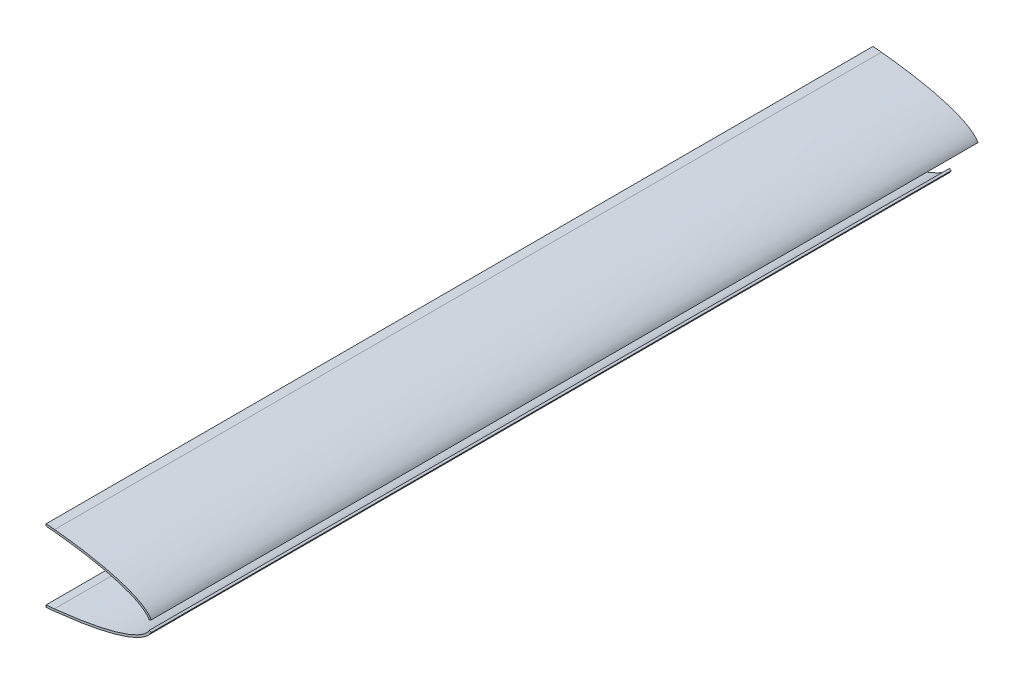
ISO-10303-21;
HEADER;
FILE_DESCRIPTION(('STEP AP214'),'2;1');
FILE_NAME('part.step','',(''),(''),'','','');
FILE_SCHEMA(('AUTOMOTIVE_DESIGN { 1 0 10303 214 1 1 1 1 }'));
ENDSEC;
DATA;
#1=APPLICATION_CONTEXT('core data for automotive mechanical design processes');
#2=APPLICATION_PROTOCOL_DEFINITION('international standard','automotive_design',2000,#1);
#3=PRODUCT_CONTEXT('',#1,'mechanical');
#4=PRODUCT('Part','Part','',(#3));
#5=PRODUCT_RELATED_PRODUCT_CATEGORY('part','',(#4));
#6=PRODUCT_DEFINITION_FORMATION('','',#4);
#7=PRODUCT_DEFINITION_CONTEXT('part definition',#1,'design');
#8=PRODUCT_DEFINITION('design','',#6,#7);
#9=PRODUCT_DEFINITION_SHAPE('','',#8);
#10=(LENGTH_UNIT() NAMED_UNIT(*) SI_UNIT(.MILLI.,.METRE.));
#11=(NAMED_UNIT(*) PLANE_ANGLE_UNIT() SI_UNIT($,.RADIAN.));
#12=(NAMED_UNIT(*) SI_UNIT($,.STERADIAN.) SOLID_ANGLE_UNIT());
#13=UNCERTAINTY_MEASURE_WITH_UNIT(LENGTH_MEASURE(1.E-05),#10,'distance_accuracy_value','');
#14=(GEOMETRIC_REPRESENTATION_CONTEXT(3) GLOBAL_UNCERTAINTY_ASSIGNED_CONTEXT((#13)) GLOBAL_UNIT_ASSIGNED_CONTEXT((#10,
#11,#12)) REPRESENTATION_CONTEXT('',''));
#15=CARTESIAN_POINT('',(0.,0.,0.));
#16=DIRECTION('',(0.,0.,1.));
#17=DIRECTION('',(1.,0.,0.));
#18=AXIS2_PLACEMENT_3D('',#15,#16,#17);
#19=CARTESIAN_POINT('',(-17.8276872824854,9.47716523599978,0.));
#20=DIRECTION('',(0.,0.,-1.));
#21=DIRECTION('',(-1.,0.,0.));
#22=AXIS2_PLACEMENT_3D('',#19,#20,#21);
#23=PLANE('',#22);
#24=DIRECTION('',(-0.995201857096887,0.0978430561200286,0.));
#25=VECTOR('',#24,1.);
#26=CARTESIAN_POINT('',(-39.9223370742047,13.597296672604,0.));
#27=LINE('',#26,#25);
#28=CARTESIAN_POINT('',(-36.7625711779221,13.2866449694229,0.));
#29=VERTEX_POINT('',#28);
#30=CARTESIAN_POINT('',(-39.9223370742047,13.597296672604,0.));
#31=VERTEX_POINT('',#30);
#32=EDGE_CURVE('E102',#29,#31,#27,.T.);
#33=ORIENTED_EDGE('',*,*,#32,.T.);
#34=DIRECTION('',(0.0978430561200288,0.995201857096887,0.));
#35=VECTOR('',#34,1.);
#36=CARTESIAN_POINT('',(-40.,12.8073551985334,0.));
#37=LINE('',#36,#35);
#38=CARTESIAN_POINT('',(-40.,12.8073551985334,0.));
#39=VERTEX_POINT('',#38);
#40=EDGE_CURVE('E112',#39,#31,#37,.T.);
#41=ORIENTED_EDGE('',*,*,#40,.F.);
#42=DIRECTION('',(-0.995201857096887,0.0978430561200286,0.));
#43=VECTOR('',#42,1.);
#44=CARTESIAN_POINT('',(-40.,12.8073551985334,0.));
#45=LINE('',#44,#43);
#46=CARTESIAN_POINT('',(-36.8402341037174,12.4967034953523,0.));
#47=VERTEX_POINT('',#46);
#48=EDGE_CURVE('E120',#47,#39,#45,.T.);
#49=ORIENTED_EDGE('',*,*,#48,.F.);
#50=CARTESIAN_POINT('',(-1.2442892760928,1.66340089002475,0.));
#51=CARTESIAN_POINT('',(-1.27242525878271,1.71540653197199,0.));
#52=CARTESIAN_POINT('',(-1.62987709724642,2.34512793132397,0.));
#53=CARTESIAN_POINT('',(-2.64193095924691,3.44237483171567,0.));
#54=CARTESIAN_POINT('',(-4.45362055951849,4.71927709804477,0.));
#55=CARTESIAN_POINT('',(-7.11196332090076,6.13879347793378,0.));
#56=CARTESIAN_POINT('',(-10.6743654661335,7.5329169527242,0.));
#57=CARTESIAN_POINT('',(-15.0977069641907,8.84405439822714,0.));
#58=CARTESIAN_POINT('',(-19.6038026955374,9.90562858592309,0.));
#59=CARTESIAN_POINT('',(-25.6757359130488,11.0735490927271,0.));
#60=CARTESIAN_POINT('',(-31.4335832927263,11.8971979691249,0.));
#61=CARTESIAN_POINT('',(-35.6762061996705,12.3745479406896,0.));
#62=CARTESIAN_POINT('',(-36.8402341037174,12.4967034953523,0.));
#63=B_SPLINE_CURVE_WITH_KNOTS('',3,(#50,#51,#52,#53,#54,#55,#56,#57,#58,#59,#60,#61,#62),
.UNSPECIFIED.,.F.,.F.,(4,1,1,1,1,1,1,1,1,1,4),(0.41988601424315,0.420294826832737,
0.424870050635321,0.429445274437905,0.434020498240489,0.443170945845658,0.452321393450826,
0.461471841055995,0.470622288661163,0.4889231838715,0.495833588787188),.UNSPECIFIED.);
#64=CARTESIAN_POINT('',(-1.2442892760928,1.66340089002475,0.));
#65=VERTEX_POINT('',#64);
#66=EDGE_CURVE('E129',#65,#47,#63,.T.);
#67=ORIENTED_EDGE('',*,*,#66,.F.);
#68=DIRECTION('',(-0.879530826423007,-0.475841912163759,0.));
#69=VECTOR('',#68,1.);
#70=CARTESIAN_POINT('',(-0.546161682619539,2.04110040780473,0.));
#71=LINE('',#70,#69);
#72=CARTESIAN_POINT('',(-0.546161682619539,2.04110040780473,0.));
#73=VERTEX_POINT('',#72);
#74=EDGE_CURVE('E131',#73,#65,#71,.T.);
#75=ORIENTED_EDGE('',*,*,#74,.F.);
#76=CARTESIAN_POINT('',(-0.546161682619548,2.04110040780474,0.));
#77=CARTESIAN_POINT('',(-0.73942626086482,2.39832403713172,0.));
#78=CARTESIAN_POINT('',(-0.975811099364009,2.73219052001871,0.));
#79=CARTESIAN_POINT('',(-1.49932731209953,3.35263200650603,0.));
#80=CARTESIAN_POINT('',(-1.78720112466863,3.64074846716842,0.));
#81=CARTESIAN_POINT('',(-2.69207506053098,4.44938106979674,0.));
#82=CARTESIAN_POINT('',(-3.35364954414454,4.91868228538405,0.));
#83=CARTESIAN_POINT('',(-4.72634330760272,5.76663571949514,0.));
#84=CARTESIAN_POINT('',(-5.44049011587012,6.14678997308819,0.));
#85=CARTESIAN_POINT('',(-6.89308628253577,6.84683797762405,0.));
#86=CARTESIAN_POINT('',(-7.63434335380513,7.16773204899856,0.));
#87=CARTESIAN_POINT('',(-9.1356114619221,7.76387457661387,0.));
#88=CARTESIAN_POINT('',(-9.89538249987687,8.03907749439548,0.));
#89=CARTESIAN_POINT('',(-11.4238527168232,8.55635266011478,0.));
#90=CARTESIAN_POINT('',(-12.1937168616249,8.79844825300241,0.));
#91=CARTESIAN_POINT('',(-14.5155288200321,9.48329718261932,0.));
#92=CARTESIAN_POINT('',(-16.0786457938354,9.88588490199509,0.));
#93=CARTESIAN_POINT('',(-19.2227055155526,10.6159586179323,0.));
#94=CARTESIAN_POINT('',(-20.8031757165205,10.9430042432049,0.));
#95=CARTESIAN_POINT('',(-23.9747023049851,11.5398768162688,0.));
#96=CARTESIAN_POINT('',(-25.5655293786609,11.8097417842051,0.));
#97=CARTESIAN_POINT('',(-28.7549007123585,12.3029658671391,0.));
#98=CARTESIAN_POINT('',(-30.3533821359578,12.5260281013711,0.));
#99=CARTESIAN_POINT('',(-32.7545126662185,12.8316599954533,0.));
#100=CARTESIAN_POINT('',(-33.5554204154358,12.9287355922407,0.));
#101=CARTESIAN_POINT('',(-34.7575572039798,13.0677995954766,0.));
#102=CARTESIAN_POINT('',(-35.1583982479571,13.1130537831186,0.));
#103=CARTESIAN_POINT('',(-35.9603190974243,13.2014310953904,0.));
#104=CARTESIAN_POINT('',(-36.3627347121612,13.2446854620371,0.));
#105=CARTESIAN_POINT('',(-36.7625711779221,13.2866449694229,0.));
#106=B_SPLINE_CURVE_WITH_KNOTS('',3,(#76,#77,#78,#79,#80,#81,#82,#83,#84,#85,#86,#87,#88,#89,
#90,#91,#92,#93,#94,#95,#96,#97,#98,#99,#100,#101,#102,#103,#104,#105),.UNSPECIFIED.,.F.,.F.,(4,
2,2,2,2,2,2,2,2,2,2,2,2,2,4),(0.,0.03125,0.0625,0.125,0.1875,0.25,0.3125,0.375,0.5,0.625,0.75,
0.875,0.9375,0.96875,1.),.UNSPECIFIED.);
#107=EDGE_CURVE('E108',#73,#29,#106,.T.);
#108=ORIENTED_EDGE('',*,*,#107,.T.);
#109=EDGE_LOOP('',(#33,#41,#49,#67,#75,#108));
#110=FACE_BOUND('',#109,.T.);
#111=ADVANCED_FACE('F47',(#110),#23,.F.);
#112=CARTESIAN_POINT('',(-40.,12.8073551985334,-351.219209435923));
#113=DIRECTION('',(0.995201857096887,-0.0978430561200288,0.));
#114=DIRECTION('',(0.0978430561200288,0.995201857096887,0.));
#115=AXIS2_PLACEMENT_3D('',#112,#113,#114);
#116=PLANE('',#115);
#117=DIRECTION('',(0.,0.,1.));
#118=VECTOR('',#117,1.);
#119=CARTESIAN_POINT('',(-39.9223370742047,13.597296672604,-351.219209435923));
#120=LINE('',#119,#118);
#121=CARTESIAN_POINT('',(-39.9223370742047,13.597296672604,-309.999999999988));
#122=VERTEX_POINT('',#121);
#123=EDGE_CURVE('E99',#122,#31,#120,.T.);
#124=ORIENTED_EDGE('',*,*,#123,.F.);
#125=DIRECTION('',(-0.0978430561200288,-0.995201857096887,0.));
#126=VECTOR('',#125,1.);
#127=CARTESIAN_POINT('',(-40.,12.8073551985334,-309.999999999988));
#128=LINE('',#127,#126);
#129=CARTESIAN_POINT('',(-40.,12.8073551985334,-309.999999999988));
#130=VERTEX_POINT('',#129);
#131=EDGE_CURVE('E52',#122,#130,#128,.T.);
#132=ORIENTED_EDGE('',*,*,#131,.T.);
#133=DIRECTION('',(0.,0.,1.));
#134=VECTOR('',#133,1.);
#135=CARTESIAN_POINT('',(-40.,12.8073551985334,-351.219209435923));
#136=LINE('',#135,#134);
#137=EDGE_CURVE('E107',#130,#39,#136,.T.);
#138=ORIENTED_EDGE('',*,*,#137,.T.);
#139=ORIENTED_EDGE('',*,*,#40,.T.);
#140=EDGE_LOOP('',(#124,#132,#138,#139));
#141=FACE_BOUND('',#140,.T.);
#142=ADVANCED_FACE('F115',(#141),#116,.F.);
#143=CARTESIAN_POINT('',(-40.,12.8073551985334,-351.219209435923));
#144=DIRECTION('',(0.0978430561200286,0.995201857096887,0.));
#145=DIRECTION('',(-0.995201857096887,0.0978430561200287,0.));
#146=AXIS2_PLACEMENT_3D('',#143,#144,#145);
#147=PLANE('',#146);
#148=ORIENTED_EDGE('',*,*,#137,.F.);
#149=DIRECTION('',(0.995201857096887,-0.0978430561200287,0.));
#150=VECTOR('',#149,1.);
#151=CARTESIAN_POINT('',(-40.,12.8073551985334,-309.999999999988));
#152=LINE('',#151,#150);
#153=CARTESIAN_POINT('',(-36.8402341037174,12.4967034953523,-309.999999999988));
#154=VERTEX_POINT('',#153);
#155=EDGE_CURVE('E160',#130,#154,#152,.T.);
#156=ORIENTED_EDGE('',*,*,#155,.T.);
#157=DIRECTION('',(0.,0.,1.));
#158=VECTOR('',#157,1.);
#159=CARTESIAN_POINT('',(-36.8402341037174,12.4967034953523,-351.219209435923));
#160=LINE('',#159,#158);
#161=EDGE_CURVE('E155',#154,#47,#160,.T.);
#162=ORIENTED_EDGE('',*,*,#161,.T.);
#163=ORIENTED_EDGE('',*,*,#48,.T.);
#164=EDGE_LOOP('',(#148,#156,#162,#163));
#165=FACE_BOUND('',#164,.T.);
#166=ADVANCED_FACE('F156',(#165),#147,.F.);
#167=CARTESIAN_POINT('',(-1.2442892760928,1.66340089002475,-351.219209435923));
#168=CARTESIAN_POINT('',(-1.27242525878271,1.71540653197199,-351.219209435923));
#169=CARTESIAN_POINT('',(-1.62987709724642,2.34512793132397,-351.219209435923));
#170=CARTESIAN_POINT('',(-2.64193095924691,3.44237483171567,-351.219209435923));
#171=CARTESIAN_POINT('',(-4.45362055951849,4.71927709804477,-351.219209435923));
#172=CARTESIAN_POINT('',(-7.11196332090076,6.13879347793378,-351.219209435923));
#173=CARTESIAN_POINT('',(-10.6743654661335,7.5329169527242,-351.219209435923));
#174=CARTESIAN_POINT('',(-15.0977069641907,8.84405439822714,-351.219209435923));
#175=CARTESIAN_POINT('',(-19.6038026955374,9.90562858592309,-351.219209435923));
#176=CARTESIAN_POINT('',(-25.6757359130488,11.0735490927271,-351.219209435923));
#177=CARTESIAN_POINT('',(-31.4335832927263,11.8971979691249,-351.219209435923));
#178=CARTESIAN_POINT('',(-35.6762061996705,12.3745479406896,-351.219209435923));
#179=CARTESIAN_POINT('',(-36.8402341037174,12.4967034953523,-351.219209435923));
#180=B_SPLINE_CURVE_WITH_KNOTS('',3,(#167,#168,#169,#170,#171,#172,#173,#174,#175,#176,#177,
#178,#179),.UNSPECIFIED.,.F.,.F.,(4,1,1,1,1,1,1,1,1,1,4),(0.41988601424315,0.420294826832737,
0.424870050635321,0.429445274437905,0.434020498240489,0.443170945845658,0.452321393450826,
0.461471841055995,0.470622288661163,0.4889231838715,0.495833588787188),.UNSPECIFIED.);
#181=DIRECTION('',(0.,0.,1.));
#182=VECTOR('',#181,1.);
#183=SURFACE_OF_LINEAR_EXTRUSION('',#180,#182);
#184=ORIENTED_EDGE('',*,*,#161,.F.);
#185=CARTESIAN_POINT('',(-1.2442892760928,1.66340089002475,-309.999999999988));
#186=CARTESIAN_POINT('',(-1.27242525878271,1.71540653197199,-309.999999999988));
#187=CARTESIAN_POINT('',(-1.62987709724642,2.34512793132397,-309.999999999988));
#188=CARTESIAN_POINT('',(-2.64193095924691,3.44237483171567,-309.999999999988));
#189=CARTESIAN_POINT('',(-4.45362055951849,4.71927709804477,-309.999999999988));
#190=CARTESIAN_POINT('',(-7.11196332090076,6.13879347793378,-309.999999999988));
#191=CARTESIAN_POINT('',(-10.6743654661335,7.5329169527242,-309.999999999988));
#192=CARTESIAN_POINT('',(-15.0977069641907,8.84405439822714,-309.999999999988));
#193=CARTESIAN_POINT('',(-19.6038026955374,9.90562858592309,-309.999999999988));
#194=CARTESIAN_POINT('',(-25.6757359130488,11.0735490927271,-309.999999999988));
#195=CARTESIAN_POINT('',(-31.4335832927263,11.8971979691249,-309.999999999988));
#196=CARTESIAN_POINT('',(-35.6762061996705,12.3745479406896,-309.999999999988));
#197=CARTESIAN_POINT('',(-36.8402341037174,12.4967034953523,-309.999999999988));
#198=B_SPLINE_CURVE_WITH_KNOTS('',3,(#185,#186,#187,#188,#189,#190,#191,#192,#193,#194,#195,
#196,#197),.UNSPECIFIED.,.F.,.F.,(4,1,1,1,1,1,1,1,1,1,4),(0.41988601424315,0.420294826832737,
0.424870050635321,0.429445274437905,0.434020498240489,0.443170945845658,0.452321393450826,
0.461471841055995,0.470622288661163,0.4889231838715,0.495833588787188),.UNSPECIFIED.);
#199=CARTESIAN_POINT('',(-1.2442892760928,1.66340089002475,-309.999999999988));
#200=VERTEX_POINT('',#199);
#201=EDGE_CURVE('E70',#154,#200,#198,.F.);
#202=ORIENTED_EDGE('',*,*,#201,.T.);
#203=DIRECTION('',(0.,0.,1.));
#204=VECTOR('',#203,1.);
#205=CARTESIAN_POINT('',(-1.2442892760928,1.66340089002475,-351.219209435923));
#206=LINE('',#205,#204);
#207=EDGE_CURVE('E147',#200,#65,#206,.T.);
#208=ORIENTED_EDGE('',*,*,#207,.T.);
#209=ORIENTED_EDGE('',*,*,#66,.T.);
#210=EDGE_LOOP('',(#184,#202,#208,#209));
#211=FACE_BOUND('',#210,.T.);
#212=ADVANCED_FACE('F159',(#211),#183,.F.);
#213=CARTESIAN_POINT('',(-0.546161682619539,2.04110040780473,-351.219209435923));
#214=DIRECTION('',(-0.475841912163759,0.879530826423007,0.));
#215=DIRECTION('',(-0.879530826423007,-0.475841912163759,0.));
#216=AXIS2_PLACEMENT_3D('',#213,#214,#215);
#217=PLANE('',#216);
#218=ORIENTED_EDGE('',*,*,#207,.F.);
#219=DIRECTION('',(0.879530826423007,0.475841912163759,0.));
#220=VECTOR('',#219,1.);
#221=CARTESIAN_POINT('',(-0.546161682619539,2.04110040780473,-309.999999999988));
#222=LINE('',#221,#220);
#223=CARTESIAN_POINT('',(-0.546161682619539,2.04110040780473,-309.999999999988));
#224=VERTEX_POINT('',#223);
#225=EDGE_CURVE('E168',#200,#224,#222,.T.);
#226=ORIENTED_EDGE('',*,*,#225,.T.);
#227=DIRECTION('',(0.,0.,1.));
#228=VECTOR('',#227,1.);
#229=CARTESIAN_POINT('',(-0.546161682619539,2.04110040780473,-351.219209435923));
#230=LINE('',#229,#228);
#231=EDGE_CURVE('E146',#224,#73,#230,.T.);
#232=ORIENTED_EDGE('',*,*,#231,.T.);
#233=ORIENTED_EDGE('',*,*,#74,.T.);
#234=EDGE_LOOP('',(#218,#226,#232,#233));
#235=FACE_BOUND('',#234,.T.);
#236=ADVANCED_FACE('F192',(#235),#217,.F.);
#237=CARTESIAN_POINT('',(-0.546161682619548,2.04110040780474,-351.219209435923));
#238=CARTESIAN_POINT('',(-0.73942626086482,2.39832403713172,-351.219209435923));
#239=CARTESIAN_POINT('',(-0.975811099364009,2.73219052001871,-351.219209435923));
#240=CARTESIAN_POINT('',(-1.49932731209953,3.35263200650603,-351.219209435923));
#241=CARTESIAN_POINT('',(-1.78720112466863,3.64074846716842,-351.219209435923));
#242=CARTESIAN_POINT('',(-2.69207506053098,4.44938106979674,-351.219209435923));
#243=CARTESIAN_POINT('',(-3.35364954414454,4.91868228538405,-351.219209435923));
#244=CARTESIAN_POINT('',(-4.72634330760272,5.76663571949514,-351.219209435923));
#245=CARTESIAN_POINT('',(-5.44049011587012,6.14678997308819,-351.219209435923));
#246=CARTESIAN_POINT('',(-6.89308628253577,6.84683797762405,-351.219209435923));
#247=CARTESIAN_POINT('',(-7.63434335380513,7.16773204899856,-351.219209435923));
#248=CARTESIAN_POINT('',(-9.1356114619221,7.76387457661387,-351.219209435923));
#249=CARTESIAN_POINT('',(-9.89538249987687,8.03907749439548,-351.219209435923));
#250=CARTESIAN_POINT('',(-11.4238527168232,8.55635266011478,-351.219209435923));
#251=CARTESIAN_POINT('',(-12.1937168616249,8.79844825300241,-351.219209435923));
#252=CARTESIAN_POINT('',(-14.5155288200321,9.48329718261932,-351.219209435923));
#253=CARTESIAN_POINT('',(-16.0786457938354,9.88588490199509,-351.219209435923));
#254=CARTESIAN_POINT('',(-19.2227055155526,10.6159586179323,-351.219209435923));
#255=CARTESIAN_POINT('',(-20.8031757165205,10.9430042432049,-351.219209435923));
#256=CARTESIAN_POINT('',(-23.9747023049851,11.5398768162688,-351.219209435923));
#257=CARTESIAN_POINT('',(-25.5655293786609,11.8097417842051,-351.219209435923));
#258=CARTESIAN_POINT('',(-28.7549007123585,12.3029658671391,-351.219209435923));
#259=CARTESIAN_POINT('',(-30.3533821359578,12.5260281013711,-351.219209435923));
#260=CARTESIAN_POINT('',(-32.7545126662185,12.8316599954533,-351.219209435923));
#261=CARTESIAN_POINT('',(-33.5554204154358,12.9287355922407,-351.219209435923));
#262=CARTESIAN_POINT('',(-34.7575572039798,13.0677995954766,-351.219209435923));
#263=CARTESIAN_POINT('',(-35.1583982479571,13.1130537831186,-351.219209435923));
#264=CARTESIAN_POINT('',(-35.9603190974243,13.2014310953904,-351.219209435923));
#265=CARTESIAN_POINT('',(-36.3627347121612,13.2446854620371,-351.219209435923));
#266=CARTESIAN_POINT('',(-36.7625711779221,13.2866449694229,-351.219209435923));
#267=B_SPLINE_CURVE_WITH_KNOTS('',3,(#237,#238,#239,#240,#241,#242,#243,#244,#245,#246,#247,
#248,#249,#250,#251,#252,#253,#254,#255,#256,#257,#258,#259,#260,#261,#262,#263,#264,#265,#266),
.UNSPECIFIED.,.F.,.F.,(4,2,2,2,2,2,2,2,2,2,2,2,2,2,4),(0.,0.03125,0.0625,0.125,0.1875,0.25,
0.3125,0.375,0.5,0.625,0.75,0.875,0.9375,0.96875,1.),.UNSPECIFIED.);
#268=DIRECTION('',(0.,0.,1.));
#269=VECTOR('',#268,1.);
#270=SURFACE_OF_LINEAR_EXTRUSION('',#267,#269);
#271=CARTESIAN_POINT('',(-0.546161682619548,2.04110040780474,-309.999999999988));
#272=CARTESIAN_POINT('',(-0.73942626086482,2.39832403713172,-309.999999999988));
#273=CARTESIAN_POINT('',(-0.975811099364009,2.73219052001871,-309.999999999988));
#274=CARTESIAN_POINT('',(-1.49932731209953,3.35263200650603,-309.999999999988));
#275=CARTESIAN_POINT('',(-1.78720112466863,3.64074846716842,-309.999999999988));
#276=CARTESIAN_POINT('',(-2.69207506053098,4.44938106979674,-309.999999999988));
#277=CARTESIAN_POINT('',(-3.35364954414454,4.91868228538405,-309.999999999988));
#278=CARTESIAN_POINT('',(-4.72634330760272,5.76663571949514,-309.999999999988));
#279=CARTESIAN_POINT('',(-5.44049011587012,6.14678997308819,-309.999999999988));
#280=CARTESIAN_POINT('',(-6.89308628253577,6.84683797762405,-309.999999999988));
#281=CARTESIAN_POINT('',(-7.63434335380513,7.16773204899856,-309.999999999988));
#282=CARTESIAN_POINT('',(-9.1356114619221,7.76387457661387,-309.999999999988));
#283=CARTESIAN_POINT('',(-9.89538249987687,8.03907749439548,-309.999999999988));
#284=CARTESIAN_POINT('',(-11.4238527168232,8.55635266011478,-309.999999999988));
#285=CARTESIAN_POINT('',(-12.1937168616249,8.79844825300241,-309.999999999988));
#286=CARTESIAN_POINT('',(-14.5155288200321,9.48329718261932,-309.999999999988));
#287=CARTESIAN_POINT('',(-16.0786457938354,9.88588490199509,-309.999999999988));
#288=CARTESIAN_POINT('',(-19.2227055155526,10.6159586179323,-309.999999999988));
#289=CARTESIAN_POINT('',(-20.8031757165205,10.9430042432049,-309.999999999988));
#290=CARTESIAN_POINT('',(-23.9747023049851,11.5398768162688,-309.999999999988));
#291=CARTESIAN_POINT('',(-25.5655293786609,11.8097417842051,-309.999999999988));
#292=CARTESIAN_POINT('',(-28.7549007123585,12.3029658671391,-309.999999999988));
#293=CARTESIAN_POINT('',(-30.3533821359578,12.5260281013711,-309.999999999988));
#294=CARTESIAN_POINT('',(-32.7545126662185,12.8316599954533,-309.999999999988));
#295=CARTESIAN_POINT('',(-33.5554204154358,12.9287355922407,-309.999999999988));
#296=CARTESIAN_POINT('',(-34.7575572039798,13.0677995954766,-309.999999999988));
#297=CARTESIAN_POINT('',(-35.1583982479571,13.1130537831186,-309.999999999988));
#298=CARTESIAN_POINT('',(-35.9603190974243,13.2014310953904,-309.999999999988));
#299=CARTESIAN_POINT('',(-36.3627347121612,13.2446854620371,-309.999999999988));
#300=CARTESIAN_POINT('',(-36.7625711779221,13.2866449694229,-309.999999999988));
#301=B_SPLINE_CURVE_WITH_KNOTS('',3,(#271,#272,#273,#274,#275,#276,#277,#278,#279,#280,#281,
#282,#283,#284,#285,#286,#287,#288,#289,#290,#291,#292,#293,#294,#295,#296,#297,#298,#299,#300),
.UNSPECIFIED.,.F.,.F.,(4,2,2,2,2,2,2,2,2,2,2,2,2,2,4),(0.,0.03125,0.0625,0.125,0.1875,0.25,
0.3125,0.375,0.5,0.625,0.75,0.875,0.9375,0.96875,1.),.UNSPECIFIED.);
#302=CARTESIAN_POINT('',(-36.7625711779221,13.2866449694229,-309.999999999988));
#303=VERTEX_POINT('',#302);
#304=EDGE_CURVE('E56',#303,#224,#301,.F.);
#305=ORIENTED_EDGE('',*,*,#304,.F.);
#306=DIRECTION('',(0.,0.,1.));
#307=VECTOR('',#306,1.);
#308=CARTESIAN_POINT('',(-36.7625711779221,13.2866449694229,-351.219209435923));
#309=LINE('',#308,#307);
#310=EDGE_CURVE('E141',#303,#29,#309,.T.);
#311=ORIENTED_EDGE('',*,*,#310,.T.);
#312=ORIENTED_EDGE('',*,*,#107,.F.);
#313=ORIENTED_EDGE('',*,*,#231,.F.);
#314=EDGE_LOOP('',(#305,#311,#312,#313));
#315=FACE_BOUND('',#314,.T.);
#316=ADVANCED_FACE('F167',(#315),#270,.T.);
#317=CARTESIAN_POINT('',(-39.9223370742047,13.597296672604,-351.219209435923));
#318=DIRECTION('',(0.0978430561200286,0.995201857096887,0.));
#319=DIRECTION('',(-0.995201857096887,0.0978430561200287,0.));
#320=AXIS2_PLACEMENT_3D('',#317,#318,#319);
#321=PLANE('',#320);
#322=DIRECTION('',(0.995201857096887,-0.0978430561200287,0.));
#323=VECTOR('',#322,1.);
#324=CARTESIAN_POINT('',(-39.9223370742047,13.597296672604,-309.999999999988));
#325=LINE('',#324,#323);
#326=EDGE_CURVE('E12',#122,#303,#325,.T.);
#327=ORIENTED_EDGE('',*,*,#326,.F.);
#328=ORIENTED_EDGE('',*,*,#123,.T.);
#329=ORIENTED_EDGE('',*,*,#32,.F.);
#330=ORIENTED_EDGE('',*,*,#310,.F.);
#331=EDGE_LOOP('',(#327,#328,#329,#330));
#332=FACE_BOUND('',#331,.T.);
#333=ADVANCED_FACE('F51',(#332),#321,.T.);
#334=CARTESIAN_POINT('',(0.,2.4978916350075E-11,-309.999999999988));
#335=DIRECTION('',(0.,0.,1.));
#336=DIRECTION('',(1.,0.,0.));
#337=AXIS2_PLACEMENT_3D('',#334,#335,#336);
#338=PLANE('',#337);
#339=ORIENTED_EDGE('',*,*,#326,.T.);
#340=ORIENTED_EDGE('',*,*,#304,.T.);
#341=ORIENTED_EDGE('',*,*,#225,.F.);
#342=ORIENTED_EDGE('',*,*,#201,.F.);
#343=ORIENTED_EDGE('',*,*,#155,.F.);
#344=ORIENTED_EDGE('',*,*,#131,.F.);
#345=EDGE_LOOP('',(#339,#340,#341,#342,#343,#344));
#346=FACE_BOUND('',#345,.T.);
#347=ADVANCED_FACE('F169',(#346),#338,.F.);
#348=CLOSED_SHELL('',(#111,#142,#166,#212,#236,#316,#333,#347));
#349=MANIFOLD_SOLID_BREP('B2',#348);
#350=CARTESIAN_POINT('',(-17.6506756546663,-10.2509217601623,0.));
#351=DIRECTION('',(0.,0.,-1.));
#352=DIRECTION('',(-1.,0.,0.));
#353=AXIS2_PLACEMENT_3D('',#350,#351,#352);
#354=PLANE('',#353);
#355=CARTESIAN_POINT('',(-36.7625711779163,-13.2866449698578,0.));
#356=CARTESIAN_POINT('',(-36.3627347121545,-13.2446854624671,0.));
#357=CARTESIAN_POINT('',(-35.9603190974172,-13.2014310958154,0.));
#358=CARTESIAN_POINT('',(-35.1583982479486,-13.1130537835337,0.));
#359=CARTESIAN_POINT('',(-34.7575572039706,-13.0677995958868,0.));
#360=CARTESIAN_POINT('',(-33.5554204154247,-12.928735592636,0.));
#361=CARTESIAN_POINT('',(-32.754512666206,-12.8316599958387,0.));
#362=CARTESIAN_POINT('',(-30.3533821359417,-12.5260281017268,0.));
#363=CARTESIAN_POINT('',(-28.7549007123403,-12.302965867475,0.));
#364=CARTESIAN_POINT('',(-25.5655293786389,-11.8097417845014,0.));
#365=CARTESIAN_POINT('',(-23.9747023049616,-11.5398768165456,0.));
#366=CARTESIAN_POINT('',(-20.8031757164943,-10.9430042434424,0.));
#367=CARTESIAN_POINT('',(-19.2227055155254,-10.6159586181503,0.));
#368=CARTESIAN_POINT('',(-16.0786457938073,-9.88588490217424,0.));
#369=CARTESIAN_POINT('',(-14.5155288200041,-9.48329718277919,0.));
#370=CARTESIAN_POINT('',(-12.1937168615978,-8.79844825313377,0.));
#371=CARTESIAN_POINT('',(-11.4238527167965,-8.55635266023667,0.));
#372=CARTESIAN_POINT('',(-9.89538249985138,-8.03907749449878,0.));
#373=CARTESIAN_POINT('',(-9.13561146189742,-7.76387457670787,0.));
#374=CARTESIAN_POINT('',(-7.63434335378262,-7.1677320490744,0.));
#375=CARTESIAN_POINT('',(-6.89308628251472,-6.84683797769108,0.));
#376=CARTESIAN_POINT('',(-5.44049011585178,-6.14678997313855,0.));
#377=CARTESIAN_POINT('',(-4.72634330758601,-5.7666357195373,0.));
#378=CARTESIAN_POINT('',(-3.35364954413079,-4.91868228541052,0.));
#379=CARTESIAN_POINT('',(-2.69207506052058,-4.44938106981641,0.));
#380=CARTESIAN_POINT('',(-1.78720112465995,-3.64074846717849,0.));
#381=CARTESIAN_POINT('',(-1.4993273120918,-3.35263200651327,0.));
#382=CARTESIAN_POINT('',(-0.975811099358324,-2.73219052002044,0.));
#383=CARTESIAN_POINT('',(-0.739426260860207,-2.39832403713021,0.));
#384=CARTESIAN_POINT('',(-0.546161682616181,-2.04110040780177,0.));
#385=B_SPLINE_CURVE_WITH_KNOTS('',3,(#355,#356,#357,#358,#359,#360,#361,#362,#363,#364,#365,
#366,#367,#368,#369,#370,#371,#372,#373,#374,#375,#376,#377,#378,#379,#380,#381,#382,#383,#384),
.UNSPECIFIED.,.F.,.F.,(4,2,2,2,2,2,2,2,2,2,2,2,2,2,4),(0.,0.03125,0.0624999999999999,0.125,0.25,
0.375,0.5,0.625,0.6875,0.75,0.8125,0.875,0.9375,0.96875,1.),.UNSPECIFIED.);
#386=CARTESIAN_POINT('',(-36.7625711779163,-13.2866449698578,0.));
#387=VERTEX_POINT('',#386);
#388=CARTESIAN_POINT('',(-0.546161682616138,-2.04110040780178,0.));
#389=VERTEX_POINT('',#388);
#390=EDGE_CURVE('E312',#387,#389,#385,.T.);
#391=ORIENTED_EDGE('',*,*,#390,.T.);
#392=DIRECTION('',(0.879530826425077,-0.475841912159933,0.));
#393=VECTOR('',#392,1.);
#394=CARTESIAN_POINT('',(-1.24428927609104,-1.66340089002483,0.));
#395=LINE('',#394,#393);
#396=CARTESIAN_POINT('',(-1.24428927609104,-1.66340089002483,0.));
#397=VERTEX_POINT('',#396);
#398=EDGE_CURVE('E325',#397,#389,#395,.T.);
#399=ORIENTED_EDGE('',*,*,#398,.F.);
#400=CARTESIAN_POINT('',(-36.8402341037211,-12.4967034957881,0.));
#401=CARTESIAN_POINT('',(-35.6762061996843,-12.3745479411123,0.));
#402=CARTESIAN_POINT('',(-31.4335832927541,-11.897197969498,0.));
#403=CARTESIAN_POINT('',(-25.6757359130947,-11.073549093034,0.));
#404=CARTESIAN_POINT('',(-19.6038026955956,-9.90562858616179,0.));
#405=CARTESIAN_POINT('',(-15.0977069642602,-8.84405439841703,0.));
#406=CARTESIAN_POINT('',(-10.6743654662151,-7.53291695286979,0.));
#407=CARTESIAN_POINT('',(-7.11196332099332,-6.13879347804915,0.));
#408=CARTESIAN_POINT('',(-4.45362055961453,-4.71927709814602,0.));
#409=CARTESIAN_POINT('',(-2.64193095933953,-3.44237483181399,0.));
#410=CARTESIAN_POINT('',(-1.62987709729169,-2.34512793139602,0.));
#411=CARTESIAN_POINT('',(-1.27242525880002,-1.71540653200786,0.));
#412=CARTESIAN_POINT('',(-1.24428927609104,-1.66340089002483,0.));
#413=B_SPLINE_CURVE_WITH_KNOTS('',3,(#400,#401,#402,#403,#404,#405,#406,#407,#408,#409,#410,
#411,#412),.UNSPECIFIED.,.F.,.F.,(4,1,1,1,1,1,1,1,1,1,4),(0.504166411212905,0.511076816128542,
0.529377711338879,0.538528158944047,0.547678606549216,0.556829054154384,0.565979501759553,
0.570554725562137,0.575129949364721,0.579705173167306,0.580113985757171),.UNSPECIFIED.);
#414=CARTESIAN_POINT('',(-36.8402341037211,-12.4967034957881,0.));
#415=VERTEX_POINT('',#414);
#416=EDGE_CURVE('E327',#415,#397,#413,.T.);
#417=ORIENTED_EDGE('',*,*,#416,.F.);
#418=DIRECTION('',(0.995201857095708,0.0978430561320266,0.));
#419=VECTOR('',#418,1.);
#420=CARTESIAN_POINT('',(-40.,-12.8073551990073,0.));
#421=LINE('',#420,#419);
#422=CARTESIAN_POINT('',(-40.,-12.8073551990073,0.));
#423=VERTEX_POINT('',#422);
#424=EDGE_CURVE('E347',#423,#415,#421,.T.);
#425=ORIENTED_EDGE('',*,*,#424,.F.);
#426=DIRECTION('',(-0.0978430561320228,0.995201857095708,0.));
#427=VECTOR('',#426,1.);
#428=CARTESIAN_POINT('',(-39.9223370741952,-13.597296673077,0.));
#429=LINE('',#428,#427);
#430=CARTESIAN_POINT('',(-39.9223370741952,-13.597296673077,0.));
#431=VERTEX_POINT('',#430);
#432=EDGE_CURVE('E355',#431,#423,#429,.T.);
#433=ORIENTED_EDGE('',*,*,#432,.F.);
#434=DIRECTION('',(0.995201857095708,0.0978430561320266,0.));
#435=VECTOR('',#434,1.);
#436=CARTESIAN_POINT('',(-39.9223370741952,-13.597296673077,0.));
#437=LINE('',#436,#435);
#438=EDGE_CURVE('E319',#431,#387,#437,.T.);
#439=ORIENTED_EDGE('',*,*,#438,.T.);
#440=EDGE_LOOP('',(#391,#399,#417,#425,#433,#439));
#441=FACE_BOUND('',#440,.T.);
#442=ADVANCED_FACE('F259',(#441),#354,.F.);
#443=CARTESIAN_POINT('',(-1.24428927609104,-1.66340089002483,-351.219209436063));
#444=DIRECTION('',(-0.475841912159933,-0.879530826425077,0.));
#445=DIRECTION('',(0.879530826425077,-0.475841912159933,0.));
#446=AXIS2_PLACEMENT_3D('',#443,#444,#445);
#447=PLANE('',#446);
#448=DIRECTION('',(0.,0.,1.));
#449=VECTOR('',#448,1.);
#450=CARTESIAN_POINT('',(-0.546161682616138,-2.04110040780178,-351.219209436063));
#451=LINE('',#450,#449);
#452=CARTESIAN_POINT('',(-0.546161682616138,-2.04110040780178,-299.999999999988));
#453=VERTEX_POINT('',#452);
#454=EDGE_CURVE('E313',#453,#389,#451,.T.);
#455=ORIENTED_EDGE('',*,*,#454,.F.);
#456=DIRECTION('',(-0.879530826425077,0.475841912159933,0.));
#457=VECTOR('',#456,1.);
#458=CARTESIAN_POINT('',(-1.24428927609104,-1.66340089002483,-299.999999999988));
#459=LINE('',#458,#457);
#460=CARTESIAN_POINT('',(-1.24428927609104,-1.66340089002483,-299.999999999988));
#461=VERTEX_POINT('',#460);
#462=EDGE_CURVE('E262',#453,#461,#459,.T.);
#463=ORIENTED_EDGE('',*,*,#462,.T.);
#464=DIRECTION('',(0.,0.,1.));
#465=VECTOR('',#464,1.);
#466=CARTESIAN_POINT('',(-1.24428927609104,-1.66340089002483,-351.219209436063));
#467=LINE('',#466,#465);
#468=EDGE_CURVE('E317',#461,#397,#467,.T.);
#469=ORIENTED_EDGE('',*,*,#468,.T.);
#470=ORIENTED_EDGE('',*,*,#398,.T.);
#471=EDGE_LOOP('',(#455,#463,#469,#470));
#472=FACE_BOUND('',#471,.T.);
#473=ADVANCED_FACE('F323',(#472),#447,.F.);
#474=CARTESIAN_POINT('',(-36.8402341037211,-12.4967034957881,-351.219209436063));
#475=CARTESIAN_POINT('',(-35.6762061996843,-12.3745479411123,-351.219209436063));
#476=CARTESIAN_POINT('',(-31.4335832927541,-11.897197969498,-351.219209436063));
#477=CARTESIAN_POINT('',(-25.6757359130947,-11.073549093034,-351.219209436063));
#478=CARTESIAN_POINT('',(-19.6038026955956,-9.90562858616179,-351.219209436063));
#479=CARTESIAN_POINT('',(-15.0977069642602,-8.84405439841703,-351.219209436063));
#480=CARTESIAN_POINT('',(-10.6743654662151,-7.53291695286979,-351.219209436063));
#481=CARTESIAN_POINT('',(-7.11196332099332,-6.13879347804915,-351.219209436063));
#482=CARTESIAN_POINT('',(-4.45362055961453,-4.71927709814602,-351.219209436063));
#483=CARTESIAN_POINT('',(-2.64193095933953,-3.44237483181399,-351.219209436063));
#484=CARTESIAN_POINT('',(-1.62987709729169,-2.34512793139602,-351.219209436063));
#485=CARTESIAN_POINT('',(-1.27242525880002,-1.71540653200786,-351.219209436063));
#486=CARTESIAN_POINT('',(-1.24428927609104,-1.66340089002483,-351.219209436063));
#487=B_SPLINE_CURVE_WITH_KNOTS('',3,(#474,#475,#476,#477,#478,#479,#480,#481,#482,#483,#484,
#485,#486),.UNSPECIFIED.,.F.,.F.,(4,1,1,1,1,1,1,1,1,1,4),(0.504166411212905,0.511076816128542,
0.529377711338879,0.538528158944047,0.547678606549216,0.556829054154384,0.565979501759553,
0.570554725562137,0.575129949364721,0.579705173167306,0.580113985757171),.UNSPECIFIED.);
#488=DIRECTION('',(0.,0.,1.));
#489=VECTOR('',#488,1.);
#490=SURFACE_OF_LINEAR_EXTRUSION('',#487,#489);
#491=ORIENTED_EDGE('',*,*,#468,.F.);
#492=CARTESIAN_POINT('',(-36.8402341037211,-12.4967034957881,-299.999999999988));
#493=CARTESIAN_POINT('',(-35.6762061996843,-12.3745479411123,-299.999999999988));
#494=CARTESIAN_POINT('',(-31.4335832927541,-11.897197969498,-299.999999999988));
#495=CARTESIAN_POINT('',(-25.6757359130947,-11.073549093034,-299.999999999988));
#496=CARTESIAN_POINT('',(-19.6038026955956,-9.90562858616179,-299.999999999988));
#497=CARTESIAN_POINT('',(-15.0977069642602,-8.84405439841703,-299.999999999988));
#498=CARTESIAN_POINT('',(-10.6743654662151,-7.53291695286979,-299.999999999988));
#499=CARTESIAN_POINT('',(-7.11196332099332,-6.13879347804915,-299.999999999988));
#500=CARTESIAN_POINT('',(-4.45362055961453,-4.71927709814602,-299.999999999988));
#501=CARTESIAN_POINT('',(-2.64193095933953,-3.44237483181399,-299.999999999988));
#502=CARTESIAN_POINT('',(-1.62987709729169,-2.34512793139602,-299.999999999988));
#503=CARTESIAN_POINT('',(-1.27242525880002,-1.71540653200786,-299.999999999988));
#504=CARTESIAN_POINT('',(-1.24428927609104,-1.66340089002483,-299.999999999988));
#505=B_SPLINE_CURVE_WITH_KNOTS('',3,(#492,#493,#494,#495,#496,#497,#498,#499,#500,#501,#502,
#503,#504),.UNSPECIFIED.,.F.,.F.,(4,1,1,1,1,1,1,1,1,1,4),(0.504166411212905,0.511076816128542,
0.529377711338879,0.538528158944047,0.547678606549216,0.556829054154384,0.565979501759553,
0.570554725562137,0.575129949364721,0.579705173167306,0.580113985757171),.UNSPECIFIED.);
#506=CARTESIAN_POINT('',(-36.8402341037211,-12.4967034957881,-299.999999999988));
#507=VERTEX_POINT('',#506);
#508=EDGE_CURVE('E370',#461,#507,#505,.F.);
#509=ORIENTED_EDGE('',*,*,#508,.T.);
#510=DIRECTION('',(0.,0.,1.));
#511=VECTOR('',#510,1.);
#512=CARTESIAN_POINT('',(-36.8402341037211,-12.4967034957881,-351.219209436063));
#513=LINE('',#512,#511);
#514=EDGE_CURVE('E362',#507,#415,#513,.T.);
#515=ORIENTED_EDGE('',*,*,#514,.T.);
#516=ORIENTED_EDGE('',*,*,#416,.T.);
#517=EDGE_LOOP('',(#491,#509,#515,#516));
#518=FACE_BOUND('',#517,.T.);
#519=ADVANCED_FACE('F368',(#518),#490,.F.);
#520=CARTESIAN_POINT('',(-40.,-12.8073551990073,-351.219209436063));
#521=DIRECTION('',(0.0978430561320266,-0.995201857095708,0.));
#522=DIRECTION('',(0.995201857095708,0.0978430561320266,0.));
#523=AXIS2_PLACEMENT_3D('',#520,#521,#522);
#524=PLANE('',#523);
#525=ORIENTED_EDGE('',*,*,#514,.F.);
#526=DIRECTION('',(-0.995201857095708,-0.0978430561320266,0.));
#527=VECTOR('',#526,1.);
#528=CARTESIAN_POINT('',(-40.,-12.8073551990073,-299.999999999988));
#529=LINE('',#528,#527);
#530=CARTESIAN_POINT('',(-40.,-12.8073551990073,-299.999999999988));
#531=VERTEX_POINT('',#530);
#532=EDGE_CURVE('E279',#507,#531,#529,.T.);
#533=ORIENTED_EDGE('',*,*,#532,.T.);
#534=DIRECTION('',(0.,0.,1.));
#535=VECTOR('',#534,1.);
#536=CARTESIAN_POINT('',(-40.,-12.8073551990073,-351.219209436063));
#537=LINE('',#536,#535);
#538=EDGE_CURVE('E359',#531,#423,#537,.T.);
#539=ORIENTED_EDGE('',*,*,#538,.T.);
#540=ORIENTED_EDGE('',*,*,#424,.T.);
#541=EDGE_LOOP('',(#525,#533,#539,#540));
#542=FACE_BOUND('',#541,.T.);
#543=ADVANCED_FACE('F367',(#542),#524,.F.);
#544=CARTESIAN_POINT('',(-39.9223370741952,-13.597296673077,-351.219209436063));
#545=DIRECTION('',(0.995201857095708,0.0978430561320228,0.));
#546=DIRECTION('',(-0.0978430561320229,0.995201857095708,0.));
#547=AXIS2_PLACEMENT_3D('',#544,#545,#546);
#548=PLANE('',#547);
#549=ORIENTED_EDGE('',*,*,#538,.F.);
#550=DIRECTION('',(0.0978430561320229,-0.995201857095708,0.));
#551=VECTOR('',#550,1.);
#552=CARTESIAN_POINT('',(-39.9223370741952,-13.597296673077,-299.999999999988));
#553=LINE('',#552,#551);
#554=CARTESIAN_POINT('',(-39.9223370741952,-13.597296673077,-299.999999999988));
#555=VERTEX_POINT('',#554);
#556=EDGE_CURVE('E379',#531,#555,#553,.T.);
#557=ORIENTED_EDGE('',*,*,#556,.T.);
#558=DIRECTION('',(0.,0.,1.));
#559=VECTOR('',#558,1.);
#560=CARTESIAN_POINT('',(-39.9223370741952,-13.597296673077,-351.219209436063));
#561=LINE('',#560,#559);
#562=EDGE_CURVE('E358',#555,#431,#561,.T.);
#563=ORIENTED_EDGE('',*,*,#562,.T.);
#564=ORIENTED_EDGE('',*,*,#432,.T.);
#565=EDGE_LOOP('',(#549,#557,#563,#564));
#566=FACE_BOUND('',#565,.T.);
#567=ADVANCED_FACE('F399',(#566),#548,.F.);
#568=CARTESIAN_POINT('',(-39.9223370741952,-13.597296673077,-351.219209436063));
#569=DIRECTION('',(0.0978430561320266,-0.995201857095708,0.));
#570=DIRECTION('',(0.995201857095708,0.0978430561320266,0.));
#571=AXIS2_PLACEMENT_3D('',#568,#569,#570);
#572=PLANE('',#571);
#573=DIRECTION('',(-0.995201857095708,-0.0978430561320266,0.));
#574=VECTOR('',#573,1.);
#575=CARTESIAN_POINT('',(-39.9223370741952,-13.597296673077,-299.999999999988));
#576=LINE('',#575,#574);
#577=CARTESIAN_POINT('',(-36.7625711779163,-13.2866449698578,-299.999999999988));
#578=VERTEX_POINT('',#577);
#579=EDGE_CURVE('E269',#578,#555,#576,.T.);
#580=ORIENTED_EDGE('',*,*,#579,.F.);
#581=DIRECTION('',(0.,0.,1.));
#582=VECTOR('',#581,1.);
#583=CARTESIAN_POINT('',(-36.7625711779163,-13.2866449698578,-351.219209436063));
#584=LINE('',#583,#582);
#585=EDGE_CURVE('E356',#578,#387,#584,.T.);
#586=ORIENTED_EDGE('',*,*,#585,.T.);
#587=ORIENTED_EDGE('',*,*,#438,.F.);
#588=ORIENTED_EDGE('',*,*,#562,.F.);
#589=EDGE_LOOP('',(#580,#586,#587,#588));
#590=FACE_BOUND('',#589,.T.);
#591=ADVANCED_FACE('F376',(#590),#572,.T.);
#592=CARTESIAN_POINT('',(-36.7625711779163,-13.2866449698578,-351.219209436063));
#593=CARTESIAN_POINT('',(-36.3627347121545,-13.2446854624671,-351.219209436063));
#594=CARTESIAN_POINT('',(-35.9603190974172,-13.2014310958154,-351.219209436063));
#595=CARTESIAN_POINT('',(-35.1583982479486,-13.1130537835337,-351.219209436063));
#596=CARTESIAN_POINT('',(-34.7575572039706,-13.0677995958868,-351.219209436063));
#597=CARTESIAN_POINT('',(-33.5554204154247,-12.928735592636,-351.219209436063));
#598=CARTESIAN_POINT('',(-32.754512666206,-12.8316599958387,-351.219209436063));
#599=CARTESIAN_POINT('',(-30.3533821359417,-12.5260281017268,-351.219209436063));
#600=CARTESIAN_POINT('',(-28.7549007123403,-12.302965867475,-351.219209436063));
#601=CARTESIAN_POINT('',(-25.5655293786389,-11.8097417845014,-351.219209436063));
#602=CARTESIAN_POINT('',(-23.9747023049616,-11.5398768165456,-351.219209436063));
#603=CARTESIAN_POINT('',(-20.8031757164943,-10.9430042434424,-351.219209436063));
#604=CARTESIAN_POINT('',(-19.2227055155254,-10.6159586181503,-351.219209436063));
#605=CARTESIAN_POINT('',(-16.0786457938073,-9.88588490217424,-351.219209436063));
#606=CARTESIAN_POINT('',(-14.5155288200041,-9.48329718277919,-351.219209436063));
#607=CARTESIAN_POINT('',(-12.1937168615978,-8.79844825313377,-351.219209436063));
#608=CARTESIAN_POINT('',(-11.4238527167965,-8.55635266023667,-351.219209436063));
#609=CARTESIAN_POINT('',(-9.89538249985138,-8.03907749449878,-351.219209436063));
#610=CARTESIAN_POINT('',(-9.13561146189742,-7.76387457670787,-351.219209436063));
#611=CARTESIAN_POINT('',(-7.63434335378262,-7.1677320490744,-351.219209436063));
#612=CARTESIAN_POINT('',(-6.89308628251472,-6.84683797769108,-351.219209436063));
#613=CARTESIAN_POINT('',(-5.44049011585178,-6.14678997313855,-351.219209436063));
#614=CARTESIAN_POINT('',(-4.72634330758601,-5.7666357195373,-351.219209436063));
#615=CARTESIAN_POINT('',(-3.35364954413079,-4.91868228541052,-351.219209436063));
#616=CARTESIAN_POINT('',(-2.69207506052058,-4.44938106981641,-351.219209436063));
#617=CARTESIAN_POINT('',(-1.78720112465995,-3.64074846717849,-351.219209436063));
#618=CARTESIAN_POINT('',(-1.4993273120918,-3.35263200651327,-351.219209436063));
#619=CARTESIAN_POINT('',(-0.975811099358324,-2.73219052002044,-351.219209436063));
#620=CARTESIAN_POINT('',(-0.739426260860207,-2.39832403713021,-351.219209436063));
#621=CARTESIAN_POINT('',(-0.546161682616181,-2.04110040780177,-351.219209436063));
#622=B_SPLINE_CURVE_WITH_KNOTS('',3,(#592,#593,#594,#595,#596,#597,#598,#599,#600,#601,#602,
#603,#604,#605,#606,#607,#608,#609,#610,#611,#612,#613,#614,#615,#616,#617,#618,#619,#620,#621),
.UNSPECIFIED.,.F.,.F.,(4,2,2,2,2,2,2,2,2,2,2,2,2,2,4),(0.,0.03125,0.0624999999999999,0.125,0.25,
0.375,0.5,0.625,0.6875,0.75,0.8125,0.875,0.9375,0.96875,1.),.UNSPECIFIED.);
#623=DIRECTION('',(0.,0.,1.));
#624=VECTOR('',#623,1.);
#625=SURFACE_OF_LINEAR_EXTRUSION('',#622,#624);
#626=CARTESIAN_POINT('',(-36.7625711779163,-13.2866449698578,-299.999999999988));
#627=CARTESIAN_POINT('',(-36.3627347121545,-13.2446854624671,-299.999999999988));
#628=CARTESIAN_POINT('',(-35.9603190974172,-13.2014310958154,-299.999999999988));
#629=CARTESIAN_POINT('',(-35.1583982479486,-13.1130537835337,-299.999999999988));
#630=CARTESIAN_POINT('',(-34.7575572039706,-13.0677995958868,-299.999999999988));
#631=CARTESIAN_POINT('',(-33.5554204154247,-12.928735592636,-299.999999999988));
#632=CARTESIAN_POINT('',(-32.754512666206,-12.8316599958387,-299.999999999988));
#633=CARTESIAN_POINT('',(-30.3533821359417,-12.5260281017268,-299.999999999988));
#634=CARTESIAN_POINT('',(-28.7549007123403,-12.302965867475,-299.999999999988));
#635=CARTESIAN_POINT('',(-25.5655293786389,-11.8097417845014,-299.999999999988));
#636=CARTESIAN_POINT('',(-23.9747023049616,-11.5398768165456,-299.999999999988));
#637=CARTESIAN_POINT('',(-20.8031757164943,-10.9430042434424,-299.999999999988));
#638=CARTESIAN_POINT('',(-19.2227055155254,-10.6159586181503,-299.999999999988));
#639=CARTESIAN_POINT('',(-16.0786457938073,-9.88588490217424,-299.999999999988));
#640=CARTESIAN_POINT('',(-14.5155288200041,-9.48329718277919,-299.999999999988));
#641=CARTESIAN_POINT('',(-12.1937168615978,-8.79844825313377,-299.999999999988));
#642=CARTESIAN_POINT('',(-11.4238527167965,-8.55635266023667,-299.999999999988));
#643=CARTESIAN_POINT('',(-9.89538249985138,-8.03907749449878,-299.999999999988));
#644=CARTESIAN_POINT('',(-9.13561146189742,-7.76387457670787,-299.999999999988));
#645=CARTESIAN_POINT('',(-7.63434335378262,-7.1677320490744,-299.999999999988));
#646=CARTESIAN_POINT('',(-6.89308628251472,-6.84683797769108,-299.999999999988));
#647=CARTESIAN_POINT('',(-5.44049011585178,-6.14678997313855,-299.999999999988));
#648=CARTESIAN_POINT('',(-4.72634330758601,-5.7666357195373,-299.999999999988));
#649=CARTESIAN_POINT('',(-3.35364954413079,-4.91868228541052,-299.999999999988));
#650=CARTESIAN_POINT('',(-2.69207506052058,-4.44938106981641,-299.999999999988));
#651=CARTESIAN_POINT('',(-1.78720112465995,-3.64074846717849,-299.999999999988));
#652=CARTESIAN_POINT('',(-1.4993273120918,-3.35263200651327,-299.999999999988));
#653=CARTESIAN_POINT('',(-0.975811099358324,-2.73219052002044,-299.999999999988));
#654=CARTESIAN_POINT('',(-0.739426260860207,-2.39832403713021,-299.999999999988));
#655=CARTESIAN_POINT('',(-0.546161682616181,-2.04110040780177,-299.999999999988));
#656=B_SPLINE_CURVE_WITH_KNOTS('',3,(#626,#627,#628,#629,#630,#631,#632,#633,#634,#635,#636,
#637,#638,#639,#640,#641,#642,#643,#644,#645,#646,#647,#648,#649,#650,#651,#652,#653,#654,#655),
.UNSPECIFIED.,.F.,.F.,(4,2,2,2,2,2,2,2,2,2,2,2,2,2,4),(0.,0.03125,0.0624999999999999,0.125,0.25,
0.375,0.5,0.625,0.6875,0.75,0.8125,0.875,0.9375,0.96875,1.),.UNSPECIFIED.);
#657=EDGE_CURVE('E50',#453,#578,#656,.F.);
#658=ORIENTED_EDGE('',*,*,#657,.F.);
#659=ORIENTED_EDGE('',*,*,#454,.T.);
#660=ORIENTED_EDGE('',*,*,#390,.F.);
#661=ORIENTED_EDGE('',*,*,#585,.F.);
#662=EDGE_LOOP('',(#658,#659,#660,#661));
#663=FACE_BOUND('',#662,.T.);
#664=ADVANCED_FACE('F261',(#663),#625,.T.);
#665=CARTESIAN_POINT('',(0.,2.4978916350075E-11,-299.999999999988));
#666=DIRECTION('',(0.,0.,1.));
#667=DIRECTION('',(1.,0.,0.));
#668=AXIS2_PLACEMENT_3D('',#665,#666,#667);
#669=PLANE('',#668);
#670=ORIENTED_EDGE('',*,*,#657,.T.);
#671=ORIENTED_EDGE('',*,*,#579,.T.);
#672=ORIENTED_EDGE('',*,*,#556,.F.);
#673=ORIENTED_EDGE('',*,*,#532,.F.);
#674=ORIENTED_EDGE('',*,*,#508,.F.);
#675=ORIENTED_EDGE('',*,*,#462,.F.);
#676=EDGE_LOOP('',(#670,#671,#672,#673,#674,#675));
#677=FACE_BOUND('',#676,.T.);
#678=ADVANCED_FACE('F378',(#677),#669,.F.);
#679=CLOSED_SHELL('',(#442,#473,#519,#543,#567,#591,#664,#678));
#680=MANIFOLD_SOLID_BREP('B6',#679);
#681=ADVANCED_BREP_SHAPE_REPRESENTATION('',(#18,#349,#680),#14);
#682=SHAPE_DEFINITION_REPRESENTATION(#9,#681);
ENDSEC;
END-ISO-10303-21;
